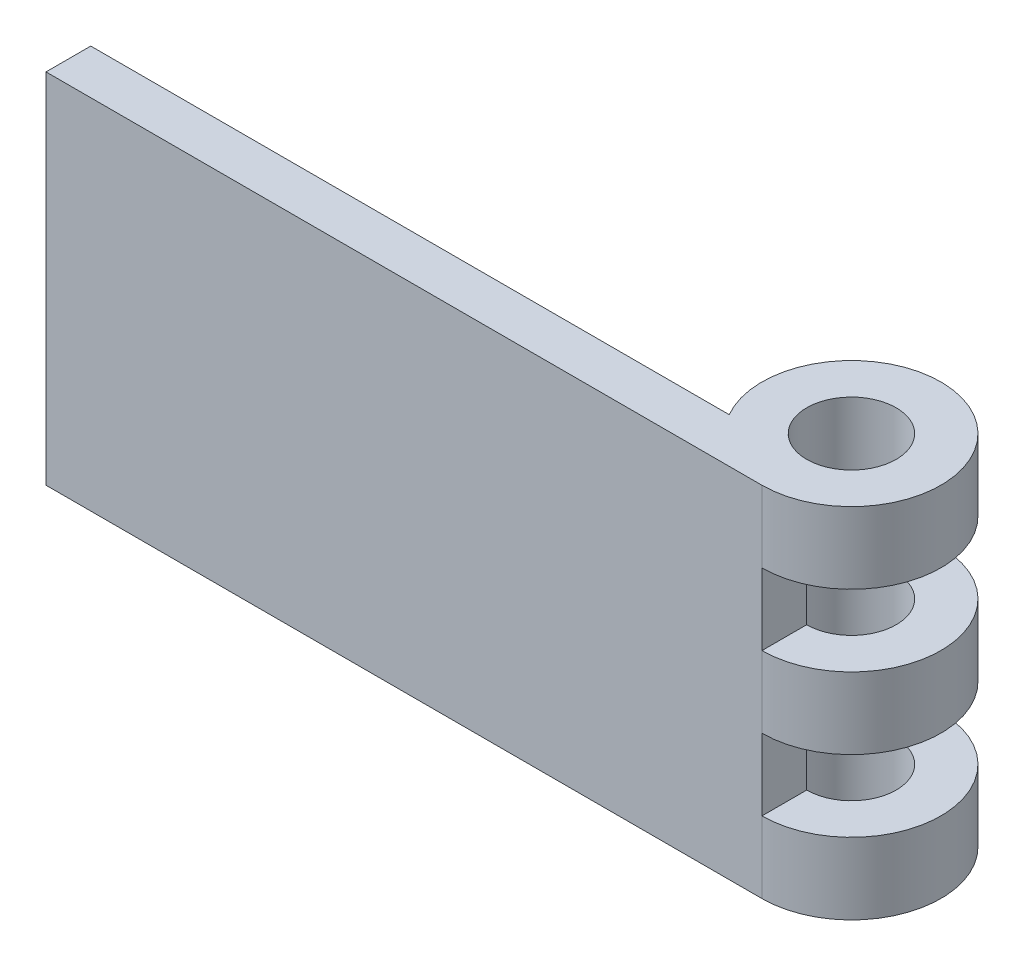
ISO-10303-21;
HEADER;
FILE_DESCRIPTION(('STEP AP214'),'2;1');
FILE_NAME('part.step','',(''),(''),'','','');
FILE_SCHEMA(('AUTOMOTIVE_DESIGN { 1 0 10303 214 1 1 1 1 }'));
ENDSEC;
DATA;
#1=APPLICATION_CONTEXT('core data for automotive mechanical design processes');
#2=APPLICATION_PROTOCOL_DEFINITION('international standard','automotive_design',2000,#1);
#3=PRODUCT_CONTEXT('',#1,'mechanical');
#4=PRODUCT('Part','Part','',(#3));
#5=PRODUCT_RELATED_PRODUCT_CATEGORY('part','',(#4));
#6=PRODUCT_DEFINITION_FORMATION('','',#4);
#7=PRODUCT_DEFINITION_CONTEXT('part definition',#1,'design');
#8=PRODUCT_DEFINITION('design','',#6,#7);
#9=PRODUCT_DEFINITION_SHAPE('','',#8);
#10=(LENGTH_UNIT() NAMED_UNIT(*) SI_UNIT(.MILLI.,.METRE.));
#11=(NAMED_UNIT(*) PLANE_ANGLE_UNIT() SI_UNIT($,.RADIAN.));
#12=(NAMED_UNIT(*) SI_UNIT($,.STERADIAN.) SOLID_ANGLE_UNIT());
#13=UNCERTAINTY_MEASURE_WITH_UNIT(LENGTH_MEASURE(1.E-05),#10,'distance_accuracy_value','');
#14=(GEOMETRIC_REPRESENTATION_CONTEXT(3) GLOBAL_UNCERTAINTY_ASSIGNED_CONTEXT((#13)) GLOBAL_UNIT_ASSIGNED_CONTEXT((#10,
#11,#12)) REPRESENTATION_CONTEXT('',''));
#15=CARTESIAN_POINT('',(0.,0.,0.));
#16=DIRECTION('',(0.,0.,1.));
#17=DIRECTION('',(1.,0.,0.));
#18=AXIS2_PLACEMENT_3D('',#15,#16,#17);
#19=CARTESIAN_POINT('',(50.8,25.4,0.));
#20=DIRECTION('',(-1.,0.,0.));
#21=DIRECTION('',(0.,0.,1.));
#22=AXIS2_PLACEMENT_3D('',#19,#20,#21);
#23=PLANE('',#22);
#24=DIRECTION('',(0.,-1.,0.));
#25=VECTOR('',#24,1.);
#26=CARTESIAN_POINT('',(50.8,25.4,0.));
#27=LINE('',#26,#25);
#28=CARTESIAN_POINT('',(50.8,10.16,0.));
#29=VERTEX_POINT('',#28);
#30=CARTESIAN_POINT('',(50.8,5.08,0.));
#31=VERTEX_POINT('',#30);
#32=EDGE_CURVE('E197',#29,#31,#27,.T.);
#33=ORIENTED_EDGE('',*,*,#32,.T.);
#34=DIRECTION('',(0.,0.,-1.));
#35=VECTOR('',#34,1.);
#36=CARTESIAN_POINT('',(50.8,5.08,0.));
#37=LINE('',#36,#35);
#38=CARTESIAN_POINT('',(50.8,5.08,-3.175));
#39=VERTEX_POINT('',#38);
#40=EDGE_CURVE('E56',#31,#39,#37,.T.);
#41=ORIENTED_EDGE('',*,*,#40,.T.);
#42=DIRECTION('',(0.,-1.,0.));
#43=VECTOR('',#42,1.);
#44=CARTESIAN_POINT('',(50.8,25.4,-3.175));
#45=LINE('',#44,#43);
#46=CARTESIAN_POINT('',(50.8,10.16,-3.175));
#47=VERTEX_POINT('',#46);
#48=EDGE_CURVE('E193',#47,#39,#45,.T.);
#49=ORIENTED_EDGE('',*,*,#48,.F.);
#50=DIRECTION('',(0.,0.,-1.));
#51=VECTOR('',#50,1.);
#52=CARTESIAN_POINT('',(50.8,10.16,0.));
#53=LINE('',#52,#51);
#54=EDGE_CURVE('E159',#29,#47,#53,.T.);
#55=ORIENTED_EDGE('',*,*,#54,.F.);
#56=EDGE_LOOP('',(#33,#41,#49,#55));
#57=FACE_BOUND('',#56,.T.);
#58=ADVANCED_FACE('F33',(#57),#23,.F.);
#59=CARTESIAN_POINT('',(0.,25.4,-3.175));
#60=DIRECTION('',(0.,0.,1.));
#61=DIRECTION('',(1.,0.,0.));
#62=AXIS2_PLACEMENT_3D('',#59,#60,#61);
#63=PLANE('',#62);
#64=DIRECTION('',(-1.,0.,0.));
#65=VECTOR('',#64,1.);
#66=CARTESIAN_POINT('',(0.,5.08,-3.175));
#67=LINE('',#66,#65);
#68=CARTESIAN_POINT('',(45.3007386859688,5.08,-3.175));
#69=VERTEX_POINT('',#68);
#70=EDGE_CURVE('E48',#39,#69,#67,.T.);
#71=ORIENTED_EDGE('',*,*,#70,.T.);
#72=DIRECTION('',(0.,1.,0.));
#73=VECTOR('',#72,1.);
#74=CARTESIAN_POINT('',(45.3007386859688,0.,-3.175));
#75=LINE('',#74,#73);
#76=CARTESIAN_POINT('',(45.3007386859688,0.,-3.175));
#77=VERTEX_POINT('',#76);
#78=EDGE_CURVE('E131',#69,#77,#75,.F.);
#79=ORIENTED_EDGE('',*,*,#78,.T.);
#80=DIRECTION('',(-1.,0.,0.));
#81=VECTOR('',#80,1.);
#82=CARTESIAN_POINT('',(0.,0.,-3.175));
#83=LINE('',#82,#81);
#84=CARTESIAN_POINT('',(0.,0.,-3.175));
#85=VERTEX_POINT('',#84);
#86=EDGE_CURVE('E121',#77,#85,#83,.T.);
#87=ORIENTED_EDGE('',*,*,#86,.T.);
#88=DIRECTION('',(0.,-1.,0.));
#89=VECTOR('',#88,1.);
#90=CARTESIAN_POINT('',(0.,25.4,-3.175));
#91=LINE('',#90,#89);
#92=CARTESIAN_POINT('',(0.,25.4,-3.175));
#93=VERTEX_POINT('',#92);
#94=EDGE_CURVE('E188',#93,#85,#91,.T.);
#95=ORIENTED_EDGE('',*,*,#94,.F.);
#96=DIRECTION('',(-1.,0.,0.));
#97=VECTOR('',#96,1.);
#98=CARTESIAN_POINT('',(0.,25.4,-3.175));
#99=LINE('',#98,#97);
#100=CARTESIAN_POINT('',(45.3007386859688,25.4,-3.175));
#101=VERTEX_POINT('',#100);
#102=EDGE_CURVE('E186',#101,#93,#99,.T.);
#103=ORIENTED_EDGE('',*,*,#102,.F.);
#104=DIRECTION('',(0.,1.,0.));
#105=VECTOR('',#104,1.);
#106=CARTESIAN_POINT('',(45.3007386859688,20.32,-3.175));
#107=LINE('',#106,#105);
#108=CARTESIAN_POINT('',(45.3007386859688,20.32,-3.175));
#109=VERTEX_POINT('',#108);
#110=EDGE_CURVE('E174',#101,#109,#107,.F.);
#111=ORIENTED_EDGE('',*,*,#110,.T.);
#112=DIRECTION('',(-1.,0.,0.));
#113=VECTOR('',#112,1.);
#114=CARTESIAN_POINT('',(0.,20.32,-3.175));
#115=LINE('',#114,#113);
#116=CARTESIAN_POINT('',(50.8,20.32,-3.175));
#117=VERTEX_POINT('',#116);
#118=EDGE_CURVE('E202',#117,#109,#115,.T.);
#119=ORIENTED_EDGE('',*,*,#118,.F.);
#120=CARTESIAN_POINT('',(50.8,15.24,-3.175));
#121=VERTEX_POINT('',#120);
#122=EDGE_CURVE('E194',#117,#121,#45,.T.);
#123=ORIENTED_EDGE('',*,*,#122,.T.);
#124=DIRECTION('',(-1.,0.,0.));
#125=VECTOR('',#124,1.);
#126=CARTESIAN_POINT('',(0.,15.24,-3.175));
#127=LINE('',#126,#125);
#128=CARTESIAN_POINT('',(45.3007386859688,15.24,-3.175));
#129=VERTEX_POINT('',#128);
#130=EDGE_CURVE('E204',#121,#129,#127,.T.);
#131=ORIENTED_EDGE('',*,*,#130,.T.);
#132=DIRECTION('',(0.,1.,0.));
#133=VECTOR('',#132,1.);
#134=CARTESIAN_POINT('',(45.3007386859688,10.16,-3.175));
#135=LINE('',#134,#133);
#136=CARTESIAN_POINT('',(45.3007386859688,10.16,-3.175));
#137=VERTEX_POINT('',#136);
#138=EDGE_CURVE('E41',#129,#137,#135,.F.);
#139=ORIENTED_EDGE('',*,*,#138,.T.);
#140=DIRECTION('',(-1.,0.,0.));
#141=VECTOR('',#140,1.);
#142=CARTESIAN_POINT('',(0.,10.16,-3.175));
#143=LINE('',#142,#141);
#144=EDGE_CURVE('E11',#47,#137,#143,.T.);
#145=ORIENTED_EDGE('',*,*,#144,.F.);
#146=ORIENTED_EDGE('',*,*,#48,.T.);
#147=EDGE_LOOP('',(#71,#79,#87,#95,#103,#111,#119,#123,#131,#139,#145,#146));
#148=FACE_BOUND('',#147,.T.);
#149=ADVANCED_FACE('F209',(#148),#63,.F.);
#150=CARTESIAN_POINT('',(50.8,20.32,0.));
#151=VERTEX_POINT('',#150);
#152=CARTESIAN_POINT('',(50.8,15.24,0.));
#153=VERTEX_POINT('',#152);
#154=EDGE_CURVE('E200',#151,#153,#27,.T.);
#155=ORIENTED_EDGE('',*,*,#154,.T.);
#156=DIRECTION('',(0.,0.,-1.));
#157=VECTOR('',#156,1.);
#158=CARTESIAN_POINT('',(50.8,15.24,0.));
#159=LINE('',#158,#157);
#160=EDGE_CURVE('E155',#153,#121,#159,.T.);
#161=ORIENTED_EDGE('',*,*,#160,.T.);
#162=ORIENTED_EDGE('',*,*,#122,.F.);
#163=DIRECTION('',(0.,0.,-1.));
#164=VECTOR('',#163,1.);
#165=CARTESIAN_POINT('',(50.8,20.32,0.));
#166=LINE('',#165,#164);
#167=EDGE_CURVE('E178',#151,#117,#166,.T.);
#168=ORIENTED_EDGE('',*,*,#167,.F.);
#169=EDGE_LOOP('',(#155,#161,#162,#168));
#170=FACE_BOUND('',#169,.T.);
#171=ADVANCED_FACE('F221',(#170),#23,.F.);
#172=CARTESIAN_POINT('',(0.,25.4,0.));
#173=DIRECTION('',(1.,0.,0.));
#174=DIRECTION('',(0.,0.,-1.));
#175=AXIS2_PLACEMENT_3D('',#172,#173,#174);
#176=PLANE('',#175);
#177=DIRECTION('',(0.,0.,1.));
#178=VECTOR('',#177,1.);
#179=CARTESIAN_POINT('',(0.,0.,0.));
#180=LINE('',#179,#178);
#181=CARTESIAN_POINT('',(0.,0.,0.));
#182=VERTEX_POINT('',#181);
#183=EDGE_CURVE('E122',#85,#182,#180,.T.);
#184=ORIENTED_EDGE('',*,*,#183,.T.);
#185=DIRECTION('',(0.,-1.,0.));
#186=VECTOR('',#185,1.);
#187=CARTESIAN_POINT('',(0.,25.4,0.));
#188=LINE('',#187,#186);
#189=CARTESIAN_POINT('',(0.,25.4,0.));
#190=VERTEX_POINT('',#189);
#191=EDGE_CURVE('E116',#190,#182,#188,.T.);
#192=ORIENTED_EDGE('',*,*,#191,.F.);
#193=DIRECTION('',(0.,0.,1.));
#194=VECTOR('',#193,1.);
#195=CARTESIAN_POINT('',(0.,25.4,0.));
#196=LINE('',#195,#194);
#197=EDGE_CURVE('E180',#93,#190,#196,.T.);
#198=ORIENTED_EDGE('',*,*,#197,.F.);
#199=ORIENTED_EDGE('',*,*,#94,.T.);
#200=EDGE_LOOP('',(#184,#192,#198,#199));
#201=FACE_BOUND('',#200,.T.);
#202=ADVANCED_FACE('F35',(#201),#176,.F.);
#203=CARTESIAN_POINT('',(0.,25.4,0.));
#204=DIRECTION('',(0.,0.,-1.));
#205=DIRECTION('',(-1.,0.,0.));
#206=AXIS2_PLACEMENT_3D('',#203,#204,#205);
#207=PLANE('',#206);
#208=DIRECTION('',(1.,0.,0.));
#209=VECTOR('',#208,1.);
#210=CARTESIAN_POINT('',(0.,0.,0.));
#211=LINE('',#210,#209);
#212=CARTESIAN_POINT('',(50.8,0.,0.));
#213=VERTEX_POINT('',#212);
#214=EDGE_CURVE('E110',#182,#213,#211,.T.);
#215=ORIENTED_EDGE('',*,*,#214,.T.);
#216=DIRECTION('',(0.,1.,0.));
#217=VECTOR('',#216,1.);
#218=CARTESIAN_POINT('',(50.8,0.,0.));
#219=LINE('',#218,#217);
#220=EDGE_CURVE('E114',#213,#31,#219,.T.);
#221=ORIENTED_EDGE('',*,*,#220,.T.);
#222=ORIENTED_EDGE('',*,*,#32,.F.);
#223=DIRECTION('',(0.,1.,0.));
#224=VECTOR('',#223,1.);
#225=CARTESIAN_POINT('',(50.8,10.16,0.));
#226=LINE('',#225,#224);
#227=EDGE_CURVE('E161',#29,#153,#226,.T.);
#228=ORIENTED_EDGE('',*,*,#227,.T.);
#229=ORIENTED_EDGE('',*,*,#154,.F.);
#230=CARTESIAN_POINT('',(50.8,25.4,0.));
#231=VERTEX_POINT('',#230);
#232=EDGE_CURVE('E198',#231,#151,#27,.T.);
#233=ORIENTED_EDGE('',*,*,#232,.F.);
#234=DIRECTION('',(1.,0.,0.));
#235=VECTOR('',#234,1.);
#236=CARTESIAN_POINT('',(0.,25.4,0.));
#237=LINE('',#236,#235);
#238=EDGE_CURVE('E183',#190,#231,#237,.T.);
#239=ORIENTED_EDGE('',*,*,#238,.F.);
#240=ORIENTED_EDGE('',*,*,#191,.T.);
#241=EDGE_LOOP('',(#215,#221,#222,#228,#229,#233,#239,#240));
#242=FACE_BOUND('',#241,.T.);
#243=ADVANCED_FACE('F112',(#242),#207,.F.);
#244=CARTESIAN_POINT('',(0.,25.4,0.));
#245=DIRECTION('',(0.,-1.,0.));
#246=DIRECTION('',(0.,0.,-1.));
#247=AXIS2_PLACEMENT_3D('',#244,#245,#246);
#248=PLANE('',#247);
#249=CARTESIAN_POINT('',(50.8,25.4,-6.35));
#250=DIRECTION('',(0.,1.,0.));
#251=DIRECTION('',(0.,0.,1.));
#252=AXIS2_PLACEMENT_3D('',#249,#250,#251);
#253=CIRCLE('',#252,3.175);
#254=CARTESIAN_POINT('',(50.8,25.4,-3.175));
#255=VERTEX_POINT('',#254);
#256=EDGE_CURVE('E164',#255,#255,#253,.T.);
#257=ORIENTED_EDGE('',*,*,#256,.F.);
#258=EDGE_LOOP('',(#257));
#259=FACE_BOUND('',#258,.T.);
#260=ORIENTED_EDGE('',*,*,#238,.T.);
#261=CARTESIAN_POINT('',(50.8,25.4,-6.35));
#262=DIRECTION('',(0.,1.,0.));
#263=DIRECTION('',(0.,0.,1.));
#264=AXIS2_PLACEMENT_3D('',#261,#262,#263);
#265=CIRCLE('',#264,6.35);
#266=EDGE_CURVE('E168',#231,#101,#265,.T.);
#267=ORIENTED_EDGE('',*,*,#266,.T.);
#268=ORIENTED_EDGE('',*,*,#102,.T.);
#269=ORIENTED_EDGE('',*,*,#197,.T.);
#270=EDGE_LOOP('',(#260,#267,#268,#269));
#271=FACE_BOUND('',#270,.T.);
#272=ADVANCED_FACE('F236',(#259,#271),#248,.F.);
#273=CARTESIAN_POINT('',(0.,0.,0.));
#274=DIRECTION('',(0.,-1.,0.));
#275=DIRECTION('',(0.,0.,-1.));
#276=AXIS2_PLACEMENT_3D('',#273,#274,#275);
#277=PLANE('',#276);
#278=CARTESIAN_POINT('',(50.8,0.,-6.35));
#279=DIRECTION('',(0.,1.,0.));
#280=DIRECTION('',(0.,0.,1.));
#281=AXIS2_PLACEMENT_3D('',#278,#279,#280);
#282=CIRCLE('',#281,3.175);
#283=CARTESIAN_POINT('',(50.8,0.,-3.175));
#284=VERTEX_POINT('',#283);
#285=EDGE_CURVE('E136',#284,#284,#282,.T.);
#286=ORIENTED_EDGE('',*,*,#285,.T.);
#287=EDGE_LOOP('',(#286));
#288=FACE_BOUND('',#287,.T.);
#289=ORIENTED_EDGE('',*,*,#86,.F.);
#290=CARTESIAN_POINT('',(50.8,0.,-6.35));
#291=DIRECTION('',(0.,1.,0.));
#292=DIRECTION('',(0.,0.,1.));
#293=AXIS2_PLACEMENT_3D('',#290,#291,#292);
#294=CIRCLE('',#293,6.35);
#295=EDGE_CURVE('E128',#213,#77,#294,.T.);
#296=ORIENTED_EDGE('',*,*,#295,.F.);
#297=ORIENTED_EDGE('',*,*,#214,.F.);
#298=ORIENTED_EDGE('',*,*,#183,.F.);
#299=EDGE_LOOP('',(#289,#296,#297,#298));
#300=FACE_BOUND('',#299,.T.);
#301=ADVANCED_FACE('F134',(#288,#300),#277,.T.);
#302=CARTESIAN_POINT('',(50.8,20.32,-6.35));
#303=DIRECTION('',(0.,1.,0.));
#304=DIRECTION('',(0.,0.,1.));
#305=AXIS2_PLACEMENT_3D('',#302,#303,#304);
#306=PLANE('',#305);
#307=CARTESIAN_POINT('',(50.8,20.32,-6.35));
#308=DIRECTION('',(0.,1.,0.));
#309=DIRECTION('',(0.,0.,1.));
#310=AXIS2_PLACEMENT_3D('',#307,#308,#309);
#311=CIRCLE('',#310,6.35);
#312=EDGE_CURVE('E171',#151,#109,#311,.T.);
#313=ORIENTED_EDGE('',*,*,#312,.F.);
#314=ORIENTED_EDGE('',*,*,#167,.T.);
#315=CARTESIAN_POINT('',(50.8,20.32,-6.35));
#316=DIRECTION('',(0.,1.,0.));
#317=DIRECTION('',(0.,0.,1.));
#318=AXIS2_PLACEMENT_3D('',#315,#316,#317);
#319=CIRCLE('',#318,3.175);
#320=EDGE_CURVE('E165',#117,#117,#319,.T.);
#321=ORIENTED_EDGE('',*,*,#320,.T.);
#322=ORIENTED_EDGE('',*,*,#118,.T.);
#323=EDGE_LOOP('',(#313,#314,#321,#322));
#324=FACE_BOUND('',#323,.T.);
#325=ADVANCED_FACE('F229',(#324),#306,.F.);
#326=CARTESIAN_POINT('',(50.8,20.32,-6.35));
#327=DIRECTION('',(0.,1.,0.));
#328=DIRECTION('',(0.,0.,1.));
#329=AXIS2_PLACEMENT_3D('',#326,#327,#328);
#330=CYLINDRICAL_SURFACE('',#329,6.35);
#331=ORIENTED_EDGE('',*,*,#232,.T.);
#332=ORIENTED_EDGE('',*,*,#312,.T.);
#333=ORIENTED_EDGE('',*,*,#110,.F.);
#334=ORIENTED_EDGE('',*,*,#266,.F.);
#335=EDGE_LOOP('',(#331,#332,#333,#334));
#336=FACE_BOUND('',#335,.T.);
#337=ADVANCED_FACE('F226',(#336),#330,.T.);
#338=CARTESIAN_POINT('',(50.8,20.32,-6.35));
#339=DIRECTION('',(0.,1.,0.));
#340=DIRECTION('',(0.,0.,1.));
#341=AXIS2_PLACEMENT_3D('',#338,#339,#340);
#342=CYLINDRICAL_SURFACE('',#341,3.175);
#343=ORIENTED_EDGE('',*,*,#256,.T.);
#344=EDGE_LOOP('',(#343));
#345=FACE_BOUND('',#344,.T.);
#346=ORIENTED_EDGE('',*,*,#320,.F.);
#347=EDGE_LOOP('',(#346));
#348=FACE_BOUND('',#347,.T.);
#349=ADVANCED_FACE('F258',(#345,#348),#342,.F.);
#350=CARTESIAN_POINT('',(50.8,10.16,-6.35));
#351=DIRECTION('',(0.,1.,0.));
#352=DIRECTION('',(0.,0.,1.));
#353=AXIS2_PLACEMENT_3D('',#350,#351,#352);
#354=CYLINDRICAL_SURFACE('',#353,6.35);
#355=ORIENTED_EDGE('',*,*,#227,.F.);
#356=CARTESIAN_POINT('',(50.8,10.16,-6.35));
#357=DIRECTION('',(0.,1.,0.));
#358=DIRECTION('',(0.,0.,1.));
#359=AXIS2_PLACEMENT_3D('',#356,#357,#358);
#360=CIRCLE('',#359,6.35);
#361=EDGE_CURVE('E152',#29,#137,#360,.T.);
#362=ORIENTED_EDGE('',*,*,#361,.T.);
#363=ORIENTED_EDGE('',*,*,#138,.F.);
#364=CARTESIAN_POINT('',(50.8,15.24,-6.35));
#365=DIRECTION('',(0.,1.,0.));
#366=DIRECTION('',(0.,0.,1.));
#367=AXIS2_PLACEMENT_3D('',#364,#365,#366);
#368=CIRCLE('',#367,6.35);
#369=EDGE_CURVE('E149',#153,#129,#368,.T.);
#370=ORIENTED_EDGE('',*,*,#369,.F.);
#371=EDGE_LOOP('',(#355,#362,#363,#370));
#372=FACE_BOUND('',#371,.T.);
#373=ADVANCED_FACE('F212',(#372),#354,.T.);
#374=CARTESIAN_POINT('',(50.8,10.16,-6.35));
#375=DIRECTION('',(0.,1.,0.));
#376=DIRECTION('',(0.,0.,1.));
#377=AXIS2_PLACEMENT_3D('',#374,#375,#376);
#378=PLANE('',#377);
#379=ORIENTED_EDGE('',*,*,#361,.F.);
#380=ORIENTED_EDGE('',*,*,#54,.T.);
#381=CARTESIAN_POINT('',(50.8,10.16,-6.35));
#382=DIRECTION('',(0.,1.,0.));
#383=DIRECTION('',(0.,0.,1.));
#384=AXIS2_PLACEMENT_3D('',#381,#382,#383);
#385=CIRCLE('',#384,3.175);
#386=EDGE_CURVE('E146',#47,#47,#385,.T.);
#387=ORIENTED_EDGE('',*,*,#386,.T.);
#388=ORIENTED_EDGE('',*,*,#144,.T.);
#389=EDGE_LOOP('',(#379,#380,#387,#388));
#390=FACE_BOUND('',#389,.T.);
#391=ADVANCED_FACE('F216',(#390),#378,.F.);
#392=CARTESIAN_POINT('',(50.8,15.24,-6.35));
#393=DIRECTION('',(0.,1.,0.));
#394=DIRECTION('',(0.,0.,1.));
#395=AXIS2_PLACEMENT_3D('',#392,#393,#394);
#396=PLANE('',#395);
#397=ORIENTED_EDGE('',*,*,#160,.F.);
#398=ORIENTED_EDGE('',*,*,#369,.T.);
#399=ORIENTED_EDGE('',*,*,#130,.F.);
#400=CARTESIAN_POINT('',(50.8,15.24,-6.35));
#401=DIRECTION('',(0.,1.,0.));
#402=DIRECTION('',(0.,0.,1.));
#403=AXIS2_PLACEMENT_3D('',#400,#401,#402);
#404=CIRCLE('',#403,3.175);
#405=EDGE_CURVE('E145',#121,#121,#404,.T.);
#406=ORIENTED_EDGE('',*,*,#405,.F.);
#407=EDGE_LOOP('',(#397,#398,#399,#406));
#408=FACE_BOUND('',#407,.T.);
#409=ADVANCED_FACE('F266',(#408),#396,.T.);
#410=CARTESIAN_POINT('',(50.8,10.16,-6.35));
#411=DIRECTION('',(0.,1.,0.));
#412=DIRECTION('',(0.,0.,1.));
#413=AXIS2_PLACEMENT_3D('',#410,#411,#412);
#414=CYLINDRICAL_SURFACE('',#413,3.175);
#415=ORIENTED_EDGE('',*,*,#405,.T.);
#416=EDGE_LOOP('',(#415));
#417=FACE_BOUND('',#416,.T.);
#418=ORIENTED_EDGE('',*,*,#386,.F.);
#419=EDGE_LOOP('',(#418));
#420=FACE_BOUND('',#419,.T.);
#421=ADVANCED_FACE('F269',(#417,#420),#414,.F.);
#422=CARTESIAN_POINT('',(50.8,5.08,-6.35));
#423=DIRECTION('',(0.,1.,0.));
#424=DIRECTION('',(0.,0.,1.));
#425=AXIS2_PLACEMENT_3D('',#422,#423,#424);
#426=PLANE('',#425);
#427=ORIENTED_EDGE('',*,*,#40,.F.);
#428=CARTESIAN_POINT('',(50.8,5.08,-6.35));
#429=DIRECTION('',(0.,1.,0.));
#430=DIRECTION('',(0.,0.,1.));
#431=AXIS2_PLACEMENT_3D('',#428,#429,#430);
#432=CIRCLE('',#431,6.35);
#433=EDGE_CURVE('E130',#31,#69,#432,.T.);
#434=ORIENTED_EDGE('',*,*,#433,.T.);
#435=ORIENTED_EDGE('',*,*,#70,.F.);
#436=CARTESIAN_POINT('',(50.8,5.08,-6.35));
#437=DIRECTION('',(0.,1.,0.));
#438=DIRECTION('',(0.,0.,1.));
#439=AXIS2_PLACEMENT_3D('',#436,#437,#438);
#440=CIRCLE('',#439,3.175);
#441=EDGE_CURVE('E139',#39,#39,#440,.T.);
#442=ORIENTED_EDGE('',*,*,#441,.F.);
#443=EDGE_LOOP('',(#427,#434,#435,#442));
#444=FACE_BOUND('',#443,.T.);
#445=ADVANCED_FACE('F275',(#444),#426,.T.);
#446=CARTESIAN_POINT('',(50.8,0.,-6.35));
#447=DIRECTION('',(0.,1.,0.));
#448=DIRECTION('',(0.,0.,1.));
#449=AXIS2_PLACEMENT_3D('',#446,#447,#448);
#450=CYLINDRICAL_SURFACE('',#449,6.35);
#451=ORIENTED_EDGE('',*,*,#78,.F.);
#452=ORIENTED_EDGE('',*,*,#433,.F.);
#453=ORIENTED_EDGE('',*,*,#220,.F.);
#454=ORIENTED_EDGE('',*,*,#295,.T.);
#455=EDGE_LOOP('',(#451,#452,#453,#454));
#456=FACE_BOUND('',#455,.T.);
#457=ADVANCED_FACE('F127',(#456),#450,.T.);
#458=CARTESIAN_POINT('',(50.8,0.,-6.35));
#459=DIRECTION('',(0.,1.,0.));
#460=DIRECTION('',(0.,0.,1.));
#461=AXIS2_PLACEMENT_3D('',#458,#459,#460);
#462=CYLINDRICAL_SURFACE('',#461,3.175);
#463=ORIENTED_EDGE('',*,*,#441,.T.);
#464=EDGE_LOOP('',(#463));
#465=FACE_BOUND('',#464,.T.);
#466=ORIENTED_EDGE('',*,*,#285,.F.);
#467=EDGE_LOOP('',(#466));
#468=FACE_BOUND('',#467,.T.);
#469=ADVANCED_FACE('F279',(#465,#468),#462,.F.);
#470=CLOSED_SHELL('',(#58,#149,#171,#202,#243,#272,#301,#325,#337,#349,#373,#391,#409,#421,#445,
#457,#469));
#471=MANIFOLD_SOLID_BREP('B2',#470);
#472=ADVANCED_BREP_SHAPE_REPRESENTATION('',(#18,#471),#14);
#473=SHAPE_DEFINITION_REPRESENTATION(#9,#472);
ENDSEC;
END-ISO-10303-21;
